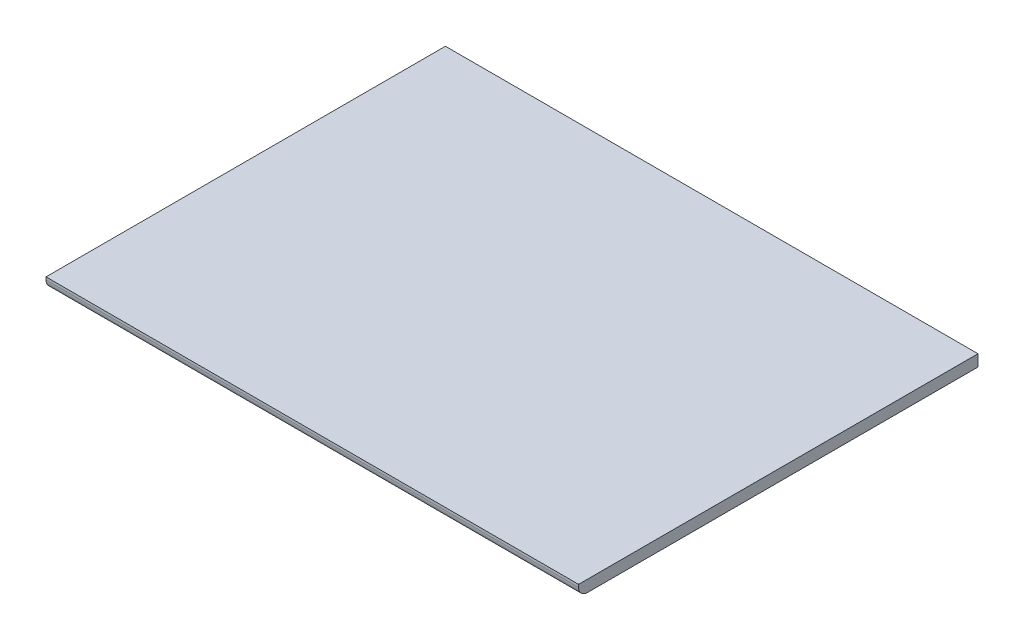
ISO-10303-21;
HEADER;
FILE_DESCRIPTION(('STEP AP214'),'2;1');
FILE_NAME('part.step','',(''),(''),'','','');
FILE_SCHEMA(('AUTOMOTIVE_DESIGN { 1 0 10303 214 1 1 1 1 }'));
ENDSEC;
DATA;
#1=APPLICATION_CONTEXT('core data for automotive mechanical design processes');
#2=APPLICATION_PROTOCOL_DEFINITION('international standard','automotive_design',2000,#1);
#3=PRODUCT_CONTEXT('',#1,'mechanical');
#4=PRODUCT('Part','Part','',(#3));
#5=PRODUCT_RELATED_PRODUCT_CATEGORY('part','',(#4));
#6=PRODUCT_DEFINITION_FORMATION('','',#4);
#7=PRODUCT_DEFINITION_CONTEXT('part definition',#1,'design');
#8=PRODUCT_DEFINITION('design','',#6,#7);
#9=PRODUCT_DEFINITION_SHAPE('','',#8);
#10=(LENGTH_UNIT() NAMED_UNIT(*) SI_UNIT(.MILLI.,.METRE.));
#11=(NAMED_UNIT(*) PLANE_ANGLE_UNIT() SI_UNIT($,.RADIAN.));
#12=(NAMED_UNIT(*) SI_UNIT($,.STERADIAN.) SOLID_ANGLE_UNIT());
#13=UNCERTAINTY_MEASURE_WITH_UNIT(LENGTH_MEASURE(1.E-05),#10,'distance_accuracy_value','');
#14=(GEOMETRIC_REPRESENTATION_CONTEXT(3) GLOBAL_UNCERTAINTY_ASSIGNED_CONTEXT((#13)) GLOBAL_UNIT_ASSIGNED_CONTEXT((#10,
#11,#12)) REPRESENTATION_CONTEXT('',''));
#15=CARTESIAN_POINT('',(0.,0.,0.));
#16=DIRECTION('',(0.,0.,1.));
#17=DIRECTION('',(1.,0.,0.));
#18=AXIS2_PLACEMENT_3D('',#15,#16,#17);
#19=CARTESIAN_POINT('',(7.375,1.2,-4.));
#20=DIRECTION('',(-1.,0.,0.));
#21=DIRECTION('',(0.,0.,1.));
#22=AXIS2_PLACEMENT_3D('',#19,#20,#21);
#23=PLANE('',#22);
#24=DIRECTION('',(0.,0.,-1.));
#25=VECTOR('',#24,1.);
#26=CARTESIAN_POINT('',(7.375,1.2,-4.));
#27=LINE('',#26,#25);
#28=CARTESIAN_POINT('',(7.375,1.2,3.));
#29=VERTEX_POINT('',#28);
#30=CARTESIAN_POINT('',(7.375,1.2,-0.1));
#31=VERTEX_POINT('',#30);
#32=EDGE_CURVE('E180',#29,#31,#27,.T.);
#33=ORIENTED_EDGE('',*,*,#32,.F.);
#34=CARTESIAN_POINT('',(7.375,0.2,3.));
#35=DIRECTION('',(-1.,0.,0.));
#36=DIRECTION('',(0.,0.,1.));
#37=AXIS2_PLACEMENT_3D('',#34,#35,#36);
#38=CIRCLE('',#37,1.);
#39=CARTESIAN_POINT('',(7.375,0.2,4.));
#40=VERTEX_POINT('',#39);
#41=EDGE_CURVE('E218',#29,#40,#38,.F.);
#42=ORIENTED_EDGE('',*,*,#41,.T.);
#43=DIRECTION('',(0.,-1.,0.));
#44=VECTOR('',#43,1.);
#45=CARTESIAN_POINT('',(7.375,1.2,4.));
#46=LINE('',#45,#44);
#47=CARTESIAN_POINT('',(7.375,0.,4.));
#48=VERTEX_POINT('',#47);
#49=EDGE_CURVE('E186',#40,#48,#46,.T.);
#50=ORIENTED_EDGE('',*,*,#49,.T.);
#51=DIRECTION('',(0.,0.,-1.));
#52=VECTOR('',#51,1.);
#53=CARTESIAN_POINT('',(7.375,0.,-4.));
#54=LINE('',#53,#52);
#55=CARTESIAN_POINT('',(7.375,0.,-1.));
#56=VERTEX_POINT('',#55);
#57=EDGE_CURVE('E179',#48,#56,#54,.T.);
#58=ORIENTED_EDGE('',*,*,#57,.T.);
#59=CARTESIAN_POINT('',(7.375,3.,-1.));
#60=DIRECTION('',(-1.,0.,0.));
#61=DIRECTION('',(0.,0.,1.));
#62=AXIS2_PLACEMENT_3D('',#59,#60,#61);
#63=CIRCLE('',#62,3.);
#64=CARTESIAN_POINT('',(7.375,2.75,-3.98956518577535));
#65=VERTEX_POINT('',#64);
#66=EDGE_CURVE('E211',#56,#65,#63,.F.);
#67=ORIENTED_EDGE('',*,*,#66,.T.);
#68=DIRECTION('',(0.,0.,-1.));
#69=VECTOR('',#68,1.);
#70=CARTESIAN_POINT('',(7.375,2.75,-4.));
#71=LINE('',#70,#69);
#72=CARTESIAN_POINT('',(7.375,2.75,-0.1));
#73=VERTEX_POINT('',#72);
#74=EDGE_CURVE('E170',#73,#65,#71,.T.);
#75=ORIENTED_EDGE('',*,*,#74,.F.);
#76=DIRECTION('',(0.,-1.,0.));
#77=VECTOR('',#76,1.);
#78=CARTESIAN_POINT('',(7.375,2.75,-0.1));
#79=LINE('',#78,#77);
#80=EDGE_CURVE('E172',#73,#31,#79,.T.);
#81=ORIENTED_EDGE('',*,*,#80,.T.);
#82=EDGE_LOOP('',(#33,#42,#50,#58,#67,#75,#81));
#83=FACE_BOUND('',#82,.T.);
#84=ADVANCED_FACE('F39',(#83),#23,.F.);
#85=CARTESIAN_POINT('',(-7.375,1.2,-4.));
#86=DIRECTION('',(0.,0.,1.));
#87=DIRECTION('',(1.,0.,0.));
#88=AXIS2_PLACEMENT_3D('',#85,#86,#87);
#89=PLANE('',#88);
#90=DIRECTION('',(0.,-1.,0.));
#91=VECTOR('',#90,1.);
#92=CARTESIAN_POINT('',(30.,4.05,-4.00000000000001));
#93=LINE('',#92,#91);
#94=CARTESIAN_POINT('',(30.,4.05,-4.00000000000001));
#95=VERTEX_POINT('',#94);
#96=CARTESIAN_POINT('',(30.,3.,-4.00000000000001));
#97=VERTEX_POINT('',#96);
#98=EDGE_CURVE('E162',#95,#97,#93,.T.);
#99=ORIENTED_EDGE('',*,*,#98,.T.);
#100=DIRECTION('',(-1.,0.,0.));
#101=VECTOR('',#100,1.);
#102=CARTESIAN_POINT('',(-7.375,3.,-4.));
#103=LINE('',#102,#101);
#104=CARTESIAN_POINT('',(-30.,3.,-4.));
#105=VERTEX_POINT('',#104);
#106=EDGE_CURVE('E197',#97,#105,#103,.T.);
#107=ORIENTED_EDGE('',*,*,#106,.T.);
#108=DIRECTION('',(0.,-1.,0.));
#109=VECTOR('',#108,1.);
#110=CARTESIAN_POINT('',(-30.,4.05,-4.));
#111=LINE('',#110,#109);
#112=CARTESIAN_POINT('',(-30.,4.05,-4.));
#113=VERTEX_POINT('',#112);
#114=EDGE_CURVE('E231',#113,#105,#111,.T.);
#115=ORIENTED_EDGE('',*,*,#114,.F.);
#116=DIRECTION('',(-1.,0.,0.));
#117=VECTOR('',#116,1.);
#118=CARTESIAN_POINT('',(-30.,4.05,-4.));
#119=LINE('',#118,#117);
#120=EDGE_CURVE('E149',#95,#113,#119,.T.);
#121=ORIENTED_EDGE('',*,*,#120,.F.);
#122=EDGE_LOOP('',(#99,#107,#115,#121));
#123=FACE_BOUND('',#122,.T.);
#124=ADVANCED_FACE('F239',(#123),#89,.F.);
#125=CARTESIAN_POINT('',(-7.375,1.2,-4.));
#126=DIRECTION('',(1.,0.,0.));
#127=DIRECTION('',(0.,0.,-1.));
#128=AXIS2_PLACEMENT_3D('',#125,#126,#127);
#129=PLANE('',#128);
#130=DIRECTION('',(0.,-1.,0.));
#131=VECTOR('',#130,1.);
#132=CARTESIAN_POINT('',(-7.375,1.2,4.));
#133=LINE('',#132,#131);
#134=CARTESIAN_POINT('',(-7.375,0.2,4.));
#135=VERTEX_POINT('',#134);
#136=CARTESIAN_POINT('',(-7.375,0.,4.));
#137=VERTEX_POINT('',#136);
#138=EDGE_CURVE('E195',#135,#137,#133,.T.);
#139=ORIENTED_EDGE('',*,*,#138,.F.);
#140=CARTESIAN_POINT('',(-7.375,0.2,3.));
#141=DIRECTION('',(1.,0.,0.));
#142=DIRECTION('',(0.,0.,-1.));
#143=AXIS2_PLACEMENT_3D('',#140,#141,#142);
#144=CIRCLE('',#143,1.);
#145=CARTESIAN_POINT('',(-7.375,1.2,3.));
#146=VERTEX_POINT('',#145);
#147=EDGE_CURVE('E222',#135,#146,#144,.F.);
#148=ORIENTED_EDGE('',*,*,#147,.T.);
#149=DIRECTION('',(0.,0.,1.));
#150=VECTOR('',#149,1.);
#151=CARTESIAN_POINT('',(-7.375,1.2,-4.));
#152=LINE('',#151,#150);
#153=CARTESIAN_POINT('',(-7.375,1.2,-0.1));
#154=VERTEX_POINT('',#153);
#155=EDGE_CURVE('E182',#154,#146,#152,.T.);
#156=ORIENTED_EDGE('',*,*,#155,.F.);
#157=DIRECTION('',(0.,-1.,0.));
#158=VECTOR('',#157,1.);
#159=CARTESIAN_POINT('',(-7.375,2.75,-0.1));
#160=LINE('',#159,#158);
#161=CARTESIAN_POINT('',(-7.375,2.75,-0.1));
#162=VERTEX_POINT('',#161);
#163=EDGE_CURVE('E176',#162,#154,#160,.T.);
#164=ORIENTED_EDGE('',*,*,#163,.F.);
#165=DIRECTION('',(0.,0.,1.));
#166=VECTOR('',#165,1.);
#167=CARTESIAN_POINT('',(-7.375,2.75,-4.));
#168=LINE('',#167,#166);
#169=CARTESIAN_POINT('',(-7.375,2.75,-3.98956518577535));
#170=VERTEX_POINT('',#169);
#171=EDGE_CURVE('E160',#170,#162,#168,.T.);
#172=ORIENTED_EDGE('',*,*,#171,.F.);
#173=CARTESIAN_POINT('',(-7.375,3.,-1.));
#174=DIRECTION('',(1.,0.,0.));
#175=DIRECTION('',(0.,0.,-1.));
#176=AXIS2_PLACEMENT_3D('',#173,#174,#175);
#177=CIRCLE('',#176,3.);
#178=CARTESIAN_POINT('',(-7.375,0.,-1.));
#179=VERTEX_POINT('',#178);
#180=EDGE_CURVE('E207',#170,#179,#177,.F.);
#181=ORIENTED_EDGE('',*,*,#180,.T.);
#182=DIRECTION('',(0.,0.,1.));
#183=VECTOR('',#182,1.);
#184=CARTESIAN_POINT('',(-7.375,0.,-4.));
#185=LINE('',#184,#183);
#186=EDGE_CURVE('E189',#179,#137,#185,.T.);
#187=ORIENTED_EDGE('',*,*,#186,.T.);
#188=EDGE_LOOP('',(#139,#148,#156,#164,#172,#181,#187));
#189=FACE_BOUND('',#188,.T.);
#190=ADVANCED_FACE('F253',(#189),#129,.F.);
#191=CARTESIAN_POINT('',(-7.375,1.2,4.));
#192=DIRECTION('',(0.,0.,-1.));
#193=DIRECTION('',(-1.,0.,0.));
#194=AXIS2_PLACEMENT_3D('',#191,#192,#193);
#195=PLANE('',#194);
#196=ORIENTED_EDGE('',*,*,#49,.F.);
#197=DIRECTION('',(1.,0.,0.));
#198=VECTOR('',#197,1.);
#199=CARTESIAN_POINT('',(-7.375,0.2,4.));
#200=LINE('',#199,#198);
#201=EDGE_CURVE('E220',#40,#135,#200,.F.);
#202=ORIENTED_EDGE('',*,*,#201,.T.);
#203=ORIENTED_EDGE('',*,*,#138,.T.);
#204=DIRECTION('',(1.,0.,0.));
#205=VECTOR('',#204,1.);
#206=CARTESIAN_POINT('',(-7.375,0.,4.));
#207=LINE('',#206,#205);
#208=EDGE_CURVE('E183',#137,#48,#207,.T.);
#209=ORIENTED_EDGE('',*,*,#208,.T.);
#210=EDGE_LOOP('',(#196,#202,#203,#209));
#211=FACE_BOUND('',#210,.T.);
#212=ADVANCED_FACE('F267',(#211),#195,.F.);
#213=CARTESIAN_POINT('',(0.,1.2,0.));
#214=DIRECTION('',(0.,1.,0.));
#215=DIRECTION('',(0.,0.,1.));
#216=AXIS2_PLACEMENT_3D('',#213,#214,#215);
#217=PLANE('',#216);
#218=ORIENTED_EDGE('',*,*,#155,.T.);
#219=DIRECTION('',(1.,0.,0.));
#220=VECTOR('',#219,1.);
#221=CARTESIAN_POINT('',(7.375,1.2,3.));
#222=LINE('',#221,#220);
#223=EDGE_CURVE('E215',#146,#29,#222,.T.);
#224=ORIENTED_EDGE('',*,*,#223,.T.);
#225=ORIENTED_EDGE('',*,*,#32,.T.);
#226=DIRECTION('',(1.,0.,0.));
#227=VECTOR('',#226,1.);
#228=CARTESIAN_POINT('',(-7.375,1.2,-0.1));
#229=LINE('',#228,#227);
#230=EDGE_CURVE('E157',#154,#31,#229,.T.);
#231=ORIENTED_EDGE('',*,*,#230,.F.);
#232=EDGE_LOOP('',(#218,#224,#225,#231));
#233=FACE_BOUND('',#232,.T.);
#234=ADVANCED_FACE('F273',(#233),#217,.T.);
#235=CARTESIAN_POINT('',(0.,0.,0.));
#236=DIRECTION('',(0.,1.,0.));
#237=DIRECTION('',(0.,0.,1.));
#238=AXIS2_PLACEMENT_3D('',#235,#236,#237);
#239=PLANE('',#238);
#240=ORIENTED_EDGE('',*,*,#186,.F.);
#241=DIRECTION('',(-1.,0.,0.));
#242=VECTOR('',#241,1.);
#243=CARTESIAN_POINT('',(0.,0.,-1.));
#244=LINE('',#243,#242);
#245=EDGE_CURVE('E209',#179,#56,#244,.F.);
#246=ORIENTED_EDGE('',*,*,#245,.T.);
#247=ORIENTED_EDGE('',*,*,#57,.F.);
#248=ORIENTED_EDGE('',*,*,#208,.F.);
#249=EDGE_LOOP('',(#240,#246,#247,#248));
#250=FACE_BOUND('',#249,.T.);
#251=ADVANCED_FACE('F259',(#250),#239,.F.);
#252=CARTESIAN_POINT('',(-7.375,2.75,-0.1));
#253=DIRECTION('',(0.,0.,-1.));
#254=DIRECTION('',(-1.,0.,0.));
#255=AXIS2_PLACEMENT_3D('',#252,#253,#254);
#256=PLANE('',#255);
#257=ORIENTED_EDGE('',*,*,#230,.T.);
#258=ORIENTED_EDGE('',*,*,#80,.F.);
#259=DIRECTION('',(1.,0.,0.));
#260=VECTOR('',#259,1.);
#261=CARTESIAN_POINT('',(-7.375,2.75,-0.1));
#262=LINE('',#261,#260);
#263=EDGE_CURVE('E167',#162,#73,#262,.T.);
#264=ORIENTED_EDGE('',*,*,#263,.F.);
#265=ORIENTED_EDGE('',*,*,#163,.T.);
#266=EDGE_LOOP('',(#257,#258,#264,#265));
#267=FACE_BOUND('',#266,.T.);
#268=ADVANCED_FACE('F275',(#267),#256,.F.);
#269=CARTESIAN_POINT('',(0.,2.75,0.));
#270=DIRECTION('',(0.,1.,0.));
#271=DIRECTION('',(0.,0.,1.));
#272=AXIS2_PLACEMENT_3D('',#269,#270,#271);
#273=PLANE('',#272);
#274=DIRECTION('',(0.,0.,-1.));
#275=VECTOR('',#274,1.);
#276=CARTESIAN_POINT('',(30.,2.75,-4.00000000000001));
#277=LINE('',#276,#275);
#278=CARTESIAN_POINT('',(30.,2.75,40.));
#279=VERTEX_POINT('',#278);
#280=CARTESIAN_POINT('',(30.,2.75,-3.98956518577535));
#281=VERTEX_POINT('',#280);
#282=EDGE_CURVE('E153',#279,#281,#277,.T.);
#283=ORIENTED_EDGE('',*,*,#282,.F.);
#284=DIRECTION('',(1.,0.,0.));
#285=VECTOR('',#284,1.);
#286=CARTESIAN_POINT('',(0.,2.75,40.));
#287=LINE('',#286,#285);
#288=CARTESIAN_POINT('',(-30.,2.75,40.));
#289=VERTEX_POINT('',#288);
#290=EDGE_CURVE('E47',#279,#289,#287,.F.);
#291=ORIENTED_EDGE('',*,*,#290,.T.);
#292=DIRECTION('',(0.,0.,1.));
#293=VECTOR('',#292,1.);
#294=CARTESIAN_POINT('',(-30.,2.75,-4.));
#295=LINE('',#294,#293);
#296=CARTESIAN_POINT('',(-30.,2.75,-3.98956518577535));
#297=VERTEX_POINT('',#296);
#298=EDGE_CURVE('E234',#297,#289,#295,.T.);
#299=ORIENTED_EDGE('',*,*,#298,.F.);
#300=DIRECTION('',(-1.,0.,0.));
#301=VECTOR('',#300,1.);
#302=CARTESIAN_POINT('',(-30.,2.75,-3.98956518577535));
#303=LINE('',#302,#301);
#304=EDGE_CURVE('E205',#297,#170,#303,.F.);
#305=ORIENTED_EDGE('',*,*,#304,.T.);
#306=ORIENTED_EDGE('',*,*,#171,.T.);
#307=ORIENTED_EDGE('',*,*,#263,.T.);
#308=ORIENTED_EDGE('',*,*,#74,.T.);
#309=DIRECTION('',(-1.,0.,0.));
#310=VECTOR('',#309,1.);
#311=CARTESIAN_POINT('',(7.375,2.75,-3.98956518577535));
#312=LINE('',#311,#310);
#313=EDGE_CURVE('E202',#65,#281,#312,.F.);
#314=ORIENTED_EDGE('',*,*,#313,.T.);
#315=EDGE_LOOP('',(#283,#291,#299,#305,#306,#307,#308,#314));
#316=FACE_BOUND('',#315,.T.);
#317=ADVANCED_FACE('F247',(#316),#273,.F.);
#318=CARTESIAN_POINT('',(-30.,4.05,-4.));
#319=DIRECTION('',(1.,0.,0.));
#320=DIRECTION('',(0.,0.,-1.));
#321=AXIS2_PLACEMENT_3D('',#318,#319,#320);
#322=PLANE('',#321);
#323=ORIENTED_EDGE('',*,*,#298,.T.);
#324=CARTESIAN_POINT('',(-30.,3.75,40.));
#325=DIRECTION('',(1.,0.,0.));
#326=DIRECTION('',(0.,0.,-1.));
#327=AXIS2_PLACEMENT_3D('',#324,#325,#326);
#328=CIRCLE('',#327,1.);
#329=CARTESIAN_POINT('',(-30.,3.75,41.));
#330=VERTEX_POINT('',#329);
#331=EDGE_CURVE('E11',#289,#330,#328,.F.);
#332=ORIENTED_EDGE('',*,*,#331,.T.);
#333=DIRECTION('',(0.,-1.,0.));
#334=VECTOR('',#333,1.);
#335=CARTESIAN_POINT('',(-30.,4.05,41.));
#336=LINE('',#335,#334);
#337=CARTESIAN_POINT('',(-30.,4.05,41.));
#338=VERTEX_POINT('',#337);
#339=EDGE_CURVE('E138',#338,#330,#336,.T.);
#340=ORIENTED_EDGE('',*,*,#339,.F.);
#341=DIRECTION('',(0.,0.,1.));
#342=VECTOR('',#341,1.);
#343=CARTESIAN_POINT('',(-30.,4.05,-4.));
#344=LINE('',#343,#342);
#345=EDGE_CURVE('E144',#113,#338,#344,.T.);
#346=ORIENTED_EDGE('',*,*,#345,.F.);
#347=ORIENTED_EDGE('',*,*,#114,.T.);
#348=CARTESIAN_POINT('',(-30.,3.,-1.));
#349=DIRECTION('',(1.,0.,0.));
#350=DIRECTION('',(0.,0.,-1.));
#351=AXIS2_PLACEMENT_3D('',#348,#349,#350);
#352=CIRCLE('',#351,3.);
#353=EDGE_CURVE('E200',#105,#297,#352,.F.);
#354=ORIENTED_EDGE('',*,*,#353,.T.);
#355=EDGE_LOOP('',(#323,#332,#340,#346,#347,#354));
#356=FACE_BOUND('',#355,.T.);
#357=ADVANCED_FACE('F155',(#356),#322,.F.);
#358=CARTESIAN_POINT('',(-30.,4.05,41.));
#359=DIRECTION('',(0.,0.,-1.));
#360=DIRECTION('',(-1.,0.,0.));
#361=AXIS2_PLACEMENT_3D('',#358,#359,#360);
#362=PLANE('',#361);
#363=ORIENTED_EDGE('',*,*,#339,.T.);
#364=DIRECTION('',(1.,0.,0.));
#365=VECTOR('',#364,1.);
#366=CARTESIAN_POINT('',(-30.,3.75,41.));
#367=LINE('',#366,#365);
#368=CARTESIAN_POINT('',(30.,3.75,41.));
#369=VERTEX_POINT('',#368);
#370=EDGE_CURVE('E224',#330,#369,#367,.T.);
#371=ORIENTED_EDGE('',*,*,#370,.T.);
#372=DIRECTION('',(0.,-1.,0.));
#373=VECTOR('',#372,1.);
#374=CARTESIAN_POINT('',(30.,4.05,41.));
#375=LINE('',#374,#373);
#376=CARTESIAN_POINT('',(30.,4.05,41.));
#377=VERTEX_POINT('',#376);
#378=EDGE_CURVE('E140',#377,#369,#375,.T.);
#379=ORIENTED_EDGE('',*,*,#378,.F.);
#380=DIRECTION('',(1.,0.,0.));
#381=VECTOR('',#380,1.);
#382=CARTESIAN_POINT('',(-30.,4.05,41.));
#383=LINE('',#382,#381);
#384=EDGE_CURVE('E133',#338,#377,#383,.T.);
#385=ORIENTED_EDGE('',*,*,#384,.F.);
#386=EDGE_LOOP('',(#363,#371,#379,#385));
#387=FACE_BOUND('',#386,.T.);
#388=ADVANCED_FACE('F135',(#387),#362,.F.);
#389=CARTESIAN_POINT('',(30.,4.05,-4.00000000000001));
#390=DIRECTION('',(-1.,0.,0.));
#391=DIRECTION('',(0.,0.,1.));
#392=AXIS2_PLACEMENT_3D('',#389,#390,#391);
#393=PLANE('',#392);
#394=ORIENTED_EDGE('',*,*,#378,.T.);
#395=CARTESIAN_POINT('',(30.,3.75,40.));
#396=DIRECTION('',(-1.,0.,0.));
#397=DIRECTION('',(0.,0.,1.));
#398=AXIS2_PLACEMENT_3D('',#395,#396,#397);
#399=CIRCLE('',#398,1.);
#400=EDGE_CURVE('E61',#369,#279,#399,.F.);
#401=ORIENTED_EDGE('',*,*,#400,.T.);
#402=ORIENTED_EDGE('',*,*,#282,.T.);
#403=CARTESIAN_POINT('',(30.,3.,-1.));
#404=DIRECTION('',(-1.,0.,0.));
#405=DIRECTION('',(0.,0.,1.));
#406=AXIS2_PLACEMENT_3D('',#403,#404,#405);
#407=CIRCLE('',#406,3.);
#408=EDGE_CURVE('E213',#281,#97,#407,.F.);
#409=ORIENTED_EDGE('',*,*,#408,.T.);
#410=ORIENTED_EDGE('',*,*,#98,.F.);
#411=DIRECTION('',(0.,0.,-1.));
#412=VECTOR('',#411,1.);
#413=CARTESIAN_POINT('',(30.,4.05,-4.00000000000001));
#414=LINE('',#413,#412);
#415=EDGE_CURVE('E143',#377,#95,#414,.T.);
#416=ORIENTED_EDGE('',*,*,#415,.F.);
#417=EDGE_LOOP('',(#394,#401,#402,#409,#410,#416));
#418=FACE_BOUND('',#417,.T.);
#419=ADVANCED_FACE('F227',(#418),#393,.F.);
#420=CARTESIAN_POINT('',(0.,4.05,0.));
#421=DIRECTION('',(0.,1.,0.));
#422=DIRECTION('',(0.,0.,1.));
#423=AXIS2_PLACEMENT_3D('',#420,#421,#422);
#424=PLANE('',#423);
#425=ORIENTED_EDGE('',*,*,#345,.T.);
#426=ORIENTED_EDGE('',*,*,#384,.T.);
#427=ORIENTED_EDGE('',*,*,#415,.T.);
#428=ORIENTED_EDGE('',*,*,#120,.T.);
#429=EDGE_LOOP('',(#425,#426,#427,#428));
#430=FACE_BOUND('',#429,.T.);
#431=ADVANCED_FACE('F147',(#430),#424,.T.);
#432=CARTESIAN_POINT('',(-7.375,3.,-1.));
#433=DIRECTION('',(-1.,0.,0.));
#434=DIRECTION('',(0.,0.,1.));
#435=AXIS2_PLACEMENT_3D('',#432,#433,#434);
#436=CYLINDRICAL_SURFACE('',#435,3.);
#437=ORIENTED_EDGE('',*,*,#66,.F.);
#438=ORIENTED_EDGE('',*,*,#245,.F.);
#439=ORIENTED_EDGE('',*,*,#180,.F.);
#440=ORIENTED_EDGE('',*,*,#304,.F.);
#441=ORIENTED_EDGE('',*,*,#353,.F.);
#442=ORIENTED_EDGE('',*,*,#106,.F.);
#443=ORIENTED_EDGE('',*,*,#408,.F.);
#444=ORIENTED_EDGE('',*,*,#313,.F.);
#445=EDGE_LOOP('',(#437,#438,#439,#440,#441,#442,#443,#444));
#446=FACE_BOUND('',#445,.T.);
#447=ADVANCED_FACE('F243',(#446),#436,.T.);
#448=CARTESIAN_POINT('',(0.,0.2,3.));
#449=DIRECTION('',(-1.,0.,0.));
#450=DIRECTION('',(0.,0.,1.));
#451=AXIS2_PLACEMENT_3D('',#448,#449,#450);
#452=CYLINDRICAL_SURFACE('',#451,1.);
#453=ORIENTED_EDGE('',*,*,#147,.F.);
#454=ORIENTED_EDGE('',*,*,#201,.F.);
#455=ORIENTED_EDGE('',*,*,#41,.F.);
#456=ORIENTED_EDGE('',*,*,#223,.F.);
#457=EDGE_LOOP('',(#453,#454,#455,#456));
#458=FACE_BOUND('',#457,.T.);
#459=ADVANCED_FACE('F271',(#458),#452,.T.);
#460=CARTESIAN_POINT('',(-30.,3.75,40.));
#461=DIRECTION('',(1.,0.,0.));
#462=DIRECTION('',(0.,0.,-1.));
#463=AXIS2_PLACEMENT_3D('',#460,#461,#462);
#464=CYLINDRICAL_SURFACE('',#463,1.);
#465=ORIENTED_EDGE('',*,*,#331,.F.);
#466=ORIENTED_EDGE('',*,*,#290,.F.);
#467=ORIENTED_EDGE('',*,*,#400,.F.);
#468=ORIENTED_EDGE('',*,*,#370,.F.);
#469=EDGE_LOOP('',(#465,#466,#467,#468));
#470=FACE_BOUND('',#469,.T.);
#471=ADVANCED_FACE('F41',(#470),#464,.T.);
#472=CLOSED_SHELL('',(#84,#124,#190,#212,#234,#251,#268,#317,#357,#388,#419,#431,#447,#459,#471));
#473=MANIFOLD_SOLID_BREP('B2',#472);
#474=ADVANCED_BREP_SHAPE_REPRESENTATION('',(#18,#473),#14);
#475=SHAPE_DEFINITION_REPRESENTATION(#9,#474);
ENDSEC;
END-ISO-10303-21;
